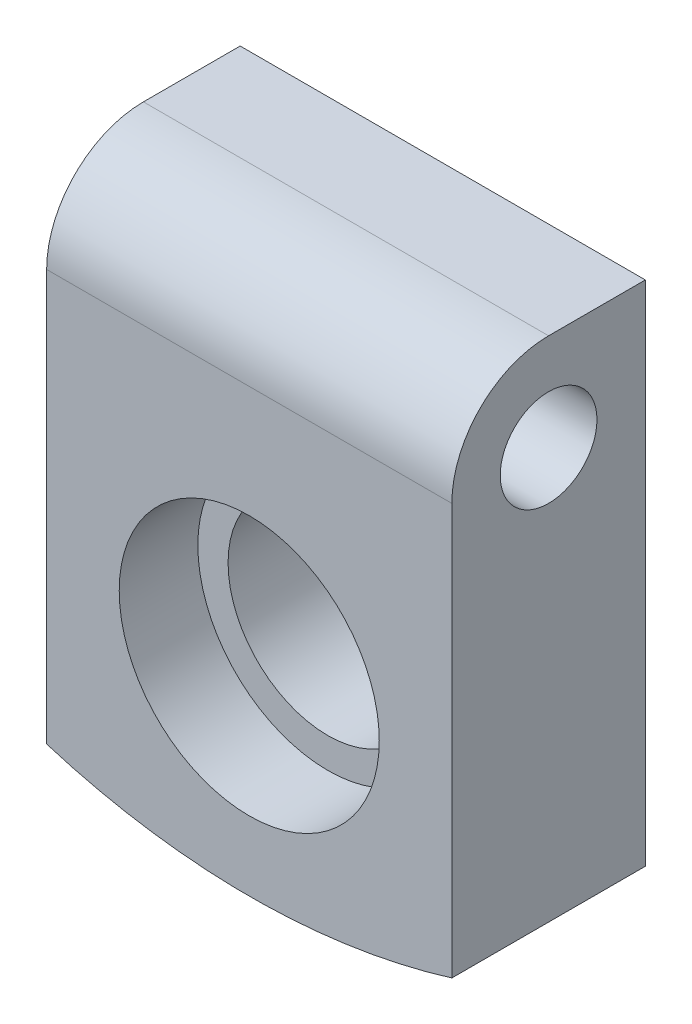
ISO-10303-21;
HEADER;
FILE_DESCRIPTION(('STEP AP214'),'2;1');
FILE_NAME('part.step','',(''),(''),'','','');
FILE_SCHEMA(('AUTOMOTIVE_DESIGN { 1 0 10303 214 1 1 1 1 }'));
ENDSEC;
DATA;
#1=APPLICATION_CONTEXT('core data for automotive mechanical design processes');
#2=APPLICATION_PROTOCOL_DEFINITION('international standard','automotive_design',2000,#1);
#3=PRODUCT_CONTEXT('',#1,'mechanical');
#4=PRODUCT('Part','Part','',(#3));
#5=PRODUCT_RELATED_PRODUCT_CATEGORY('part','',(#4));
#6=PRODUCT_DEFINITION_FORMATION('','',#4);
#7=PRODUCT_DEFINITION_CONTEXT('part definition',#1,'design');
#8=PRODUCT_DEFINITION('design','',#6,#7);
#9=PRODUCT_DEFINITION_SHAPE('','',#8);
#10=(LENGTH_UNIT() NAMED_UNIT(*) SI_UNIT(.MILLI.,.METRE.));
#11=(NAMED_UNIT(*) PLANE_ANGLE_UNIT() SI_UNIT($,.RADIAN.));
#12=(NAMED_UNIT(*) SI_UNIT($,.STERADIAN.) SOLID_ANGLE_UNIT());
#13=UNCERTAINTY_MEASURE_WITH_UNIT(LENGTH_MEASURE(1.E-05),#10,'distance_accuracy_value','');
#14=(GEOMETRIC_REPRESENTATION_CONTEXT(3) GLOBAL_UNCERTAINTY_ASSIGNED_CONTEXT((#13)) GLOBAL_UNIT_ASSIGNED_CONTEXT((#10,
#11,#12)) REPRESENTATION_CONTEXT('',''));
#15=CARTESIAN_POINT('',(0.,0.,0.));
#16=DIRECTION('',(0.,0.,1.));
#17=DIRECTION('',(1.,0.,0.));
#18=AXIS2_PLACEMENT_3D('',#15,#16,#17);
#19=CARTESIAN_POINT('',(-33.5,0.,16.));
#20=DIRECTION('',(1.,0.,0.));
#21=DIRECTION('',(0.,1.,0.));
#22=AXIS2_PLACEMENT_3D('',#19,#20,#21);
#23=PLANE('',#22);
#24=CARTESIAN_POINT('',(-33.5,-16.,0.));
#25=DIRECTION('',(1.,0.,0.));
#26=DIRECTION('',(0.,0.,-1.));
#27=AXIS2_PLACEMENT_3D('',#24,#25,#26);
#28=CIRCLE('',#27,8.);
#29=CARTESIAN_POINT('',(-33.5,-16.,-8.));
#30=VERTEX_POINT('',#29);
#31=EDGE_CURVE('E147',#30,#30,#28,.T.);
#32=ORIENTED_EDGE('',*,*,#31,.T.);
#33=EDGE_LOOP('',(#32));
#34=FACE_BOUND('',#33,.T.);
#35=DIRECTION('',(0.,-1.,0.));
#36=VECTOR('',#35,1.);
#37=CARTESIAN_POINT('',(-33.5,0.,16.));
#38=LINE('',#37,#36);
#39=CARTESIAN_POINT('',(-33.5,-16.,16.));
#40=VERTEX_POINT('',#39);
#41=CARTESIAN_POINT('',(-33.5,-83.9667380442307,16.));
#42=VERTEX_POINT('',#41);
#43=EDGE_CURVE('E69',#40,#42,#38,.T.);
#44=ORIENTED_EDGE('',*,*,#43,.F.);
#45=CARTESIAN_POINT('',(-33.5,-16.,0.));
#46=DIRECTION('',(-1.,0.,0.));
#47=DIRECTION('',(0.,0.,1.));
#48=AXIS2_PLACEMENT_3D('',#45,#46,#47);
#49=CIRCLE('',#48,16.);
#50=CARTESIAN_POINT('',(-33.5,0.,0.));
#51=VERTEX_POINT('',#50);
#52=EDGE_CURVE('E62',#40,#51,#49,.T.);
#53=ORIENTED_EDGE('',*,*,#52,.T.);
#54=DIRECTION('',(0.,0.,-1.));
#55=VECTOR('',#54,1.);
#56=CARTESIAN_POINT('',(-33.5,0.,16.));
#57=LINE('',#56,#55);
#58=CARTESIAN_POINT('',(-33.5,0.,-16.));
#59=VERTEX_POINT('',#58);
#60=EDGE_CURVE('E91',#51,#59,#57,.T.);
#61=ORIENTED_EDGE('',*,*,#60,.T.);
#62=DIRECTION('',(0.,-1.,0.));
#63=VECTOR('',#62,1.);
#64=CARTESIAN_POINT('',(-33.5,0.,-16.));
#65=LINE('',#64,#63);
#66=CARTESIAN_POINT('',(-33.5,-83.9667380442307,-16.));
#67=VERTEX_POINT('',#66);
#68=EDGE_CURVE('E86',#59,#67,#65,.T.);
#69=ORIENTED_EDGE('',*,*,#68,.T.);
#70=DIRECTION('',(0.,0.,-1.));
#71=VECTOR('',#70,1.);
#72=CARTESIAN_POINT('',(-33.5,-83.9667380442307,16.));
#73=LINE('',#72,#71);
#74=EDGE_CURVE('E89',#42,#67,#73,.T.);
#75=ORIENTED_EDGE('',*,*,#74,.F.);
#76=EDGE_LOOP('',(#44,#53,#61,#69,#75));
#77=FACE_BOUND('',#76,.T.);
#78=ADVANCED_FACE('F44',(#34,#77),#23,.F.);
#79=CARTESIAN_POINT('',(0.,25.0000000000001,16.));
#80=DIRECTION('',(0.,0.,-1.));
#81=DIRECTION('',(-1.,0.,0.));
#82=AXIS2_PLACEMENT_3D('',#79,#80,#81);
#83=CYLINDRICAL_SURFACE('',#82,114.);
#84=CARTESIAN_POINT('',(0.,25.0000000000001,-16.));
#85=DIRECTION('',(0.,0.,1.));
#86=DIRECTION('',(1.,0.,0.));
#87=AXIS2_PLACEMENT_3D('',#84,#85,#86);
#88=CIRCLE('',#87,114.);
#89=CARTESIAN_POINT('',(33.5,-83.9667380442307,-16.));
#90=VERTEX_POINT('',#89);
#91=EDGE_CURVE('E104',#67,#90,#88,.T.);
#92=ORIENTED_EDGE('',*,*,#91,.T.);
#93=DIRECTION('',(0.,0.,-1.));
#94=VECTOR('',#93,1.);
#95=CARTESIAN_POINT('',(33.5,-83.9667380442307,16.));
#96=LINE('',#95,#94);
#97=CARTESIAN_POINT('',(33.5,-83.9667380442307,16.));
#98=VERTEX_POINT('',#97);
#99=EDGE_CURVE('E11',#98,#90,#96,.T.);
#100=ORIENTED_EDGE('',*,*,#99,.F.);
#101=CARTESIAN_POINT('',(0.,25.0000000000001,16.));
#102=DIRECTION('',(0.,0.,1.));
#103=DIRECTION('',(1.,0.,0.));
#104=AXIS2_PLACEMENT_3D('',#101,#102,#103);
#105=CIRCLE('',#104,114.);
#106=EDGE_CURVE('E97',#42,#98,#105,.T.);
#107=ORIENTED_EDGE('',*,*,#106,.F.);
#108=ORIENTED_EDGE('',*,*,#74,.T.);
#109=EDGE_LOOP('',(#92,#100,#107,#108));
#110=FACE_BOUND('',#109,.T.);
#111=ADVANCED_FACE('F50',(#110),#83,.T.);
#112=CARTESIAN_POINT('',(33.5,0.,16.));
#113=DIRECTION('',(-1.,0.,0.));
#114=DIRECTION('',(0.,-1.,0.));
#115=AXIS2_PLACEMENT_3D('',#112,#113,#114);
#116=PLANE('',#115);
#117=CARTESIAN_POINT('',(33.5,-16.,0.));
#118=DIRECTION('',(1.,0.,0.));
#119=DIRECTION('',(0.,0.,-1.));
#120=AXIS2_PLACEMENT_3D('',#117,#118,#119);
#121=CIRCLE('',#120,8.);
#122=CARTESIAN_POINT('',(33.5,-16.,-8.));
#123=VERTEX_POINT('',#122);
#124=EDGE_CURVE('E152',#123,#123,#121,.T.);
#125=ORIENTED_EDGE('',*,*,#124,.F.);
#126=EDGE_LOOP('',(#125));
#127=FACE_BOUND('',#126,.T.);
#128=CARTESIAN_POINT('',(33.5,-16.,0.));
#129=DIRECTION('',(-1.,0.,0.));
#130=DIRECTION('',(0.,0.,1.));
#131=AXIS2_PLACEMENT_3D('',#128,#129,#130);
#132=CIRCLE('',#131,16.);
#133=CARTESIAN_POINT('',(33.5,-16.,16.));
#134=VERTEX_POINT('',#133);
#135=CARTESIAN_POINT('',(33.5,0.,0.));
#136=VERTEX_POINT('',#135);
#137=EDGE_CURVE('E138',#134,#136,#132,.T.);
#138=ORIENTED_EDGE('',*,*,#137,.F.);
#139=DIRECTION('',(0.,1.,0.));
#140=VECTOR('',#139,1.);
#141=CARTESIAN_POINT('',(33.5,0.,16.));
#142=LINE('',#141,#140);
#143=EDGE_CURVE('E133',#98,#134,#142,.T.);
#144=ORIENTED_EDGE('',*,*,#143,.F.);
#145=ORIENTED_EDGE('',*,*,#99,.T.);
#146=DIRECTION('',(0.,1.,0.));
#147=VECTOR('',#146,1.);
#148=CARTESIAN_POINT('',(33.5,0.,-16.));
#149=LINE('',#148,#147);
#150=CARTESIAN_POINT('',(33.5,0.,-16.));
#151=VERTEX_POINT('',#150);
#152=EDGE_CURVE('E109',#90,#151,#149,.T.);
#153=ORIENTED_EDGE('',*,*,#152,.T.);
#154=DIRECTION('',(0.,0.,-1.));
#155=VECTOR('',#154,1.);
#156=CARTESIAN_POINT('',(33.5,0.,16.));
#157=LINE('',#156,#155);
#158=EDGE_CURVE('E53',#136,#151,#157,.T.);
#159=ORIENTED_EDGE('',*,*,#158,.F.);
#160=EDGE_LOOP('',(#138,#144,#145,#153,#159));
#161=FACE_BOUND('',#160,.T.);
#162=ADVANCED_FACE('F134',(#127,#161),#116,.F.);
#163=CARTESIAN_POINT('',(-33.5,0.,16.));
#164=DIRECTION('',(0.,-1.,0.));
#165=DIRECTION('',(0.,0.,-1.));
#166=AXIS2_PLACEMENT_3D('',#163,#164,#165);
#167=PLANE('',#166);
#168=ORIENTED_EDGE('',*,*,#60,.F.);
#169=DIRECTION('',(1.,0.,0.));
#170=VECTOR('',#169,1.);
#171=CARTESIAN_POINT('',(-33.5,0.,0.));
#172=LINE('',#171,#170);
#173=EDGE_CURVE('E120',#51,#136,#172,.T.);
#174=ORIENTED_EDGE('',*,*,#173,.T.);
#175=ORIENTED_EDGE('',*,*,#158,.T.);
#176=DIRECTION('',(-1.,0.,0.));
#177=VECTOR('',#176,1.);
#178=CARTESIAN_POINT('',(-33.5,0.,-16.));
#179=LINE('',#178,#177);
#180=EDGE_CURVE('E99',#151,#59,#179,.T.);
#181=ORIENTED_EDGE('',*,*,#180,.T.);
#182=EDGE_LOOP('',(#168,#174,#175,#181));
#183=FACE_BOUND('',#182,.T.);
#184=ADVANCED_FACE('F129',(#183),#167,.F.);
#185=CARTESIAN_POINT('',(0.,25.0000000000001,16.));
#186=DIRECTION('',(0.,0.,1.));
#187=DIRECTION('',(1.,0.,0.));
#188=AXIS2_PLACEMENT_3D('',#185,#186,#187);
#189=PLANE('',#188);
#190=CARTESIAN_POINT('',(0.,-56.,16.));
#191=DIRECTION('',(0.,0.,1.));
#192=DIRECTION('',(1.,0.,0.));
#193=AXIS2_PLACEMENT_3D('',#190,#191,#192);
#194=CIRCLE('',#193,21.5);
#195=CARTESIAN_POINT('',(21.5,-56.,16.));
#196=VERTEX_POINT('',#195);
#197=EDGE_CURVE('E168',#196,#196,#194,.T.);
#198=ORIENTED_EDGE('',*,*,#197,.F.);
#199=EDGE_LOOP('',(#198));
#200=FACE_BOUND('',#199,.T.);
#201=DIRECTION('',(1.,0.,0.));
#202=VECTOR('',#201,1.);
#203=CARTESIAN_POINT('',(-33.5,-16.,16.));
#204=LINE('',#203,#202);
#205=EDGE_CURVE('E115',#40,#134,#204,.T.);
#206=ORIENTED_EDGE('',*,*,#205,.F.);
#207=ORIENTED_EDGE('',*,*,#43,.T.);
#208=ORIENTED_EDGE('',*,*,#106,.T.);
#209=ORIENTED_EDGE('',*,*,#143,.T.);
#210=EDGE_LOOP('',(#206,#207,#208,#209));
#211=FACE_BOUND('',#210,.T.);
#212=ADVANCED_FACE('F136',(#200,#211),#189,.T.);
#213=CARTESIAN_POINT('',(0.,25.0000000000001,-16.));
#214=DIRECTION('',(0.,0.,1.));
#215=DIRECTION('',(1.,0.,0.));
#216=AXIS2_PLACEMENT_3D('',#213,#214,#215);
#217=PLANE('',#216);
#218=CARTESIAN_POINT('',(0.,-56.,-16.));
#219=DIRECTION('',(0.,0.,1.));
#220=DIRECTION('',(1.,0.,0.));
#221=AXIS2_PLACEMENT_3D('',#218,#219,#220);
#222=CIRCLE('',#221,16.5);
#223=CARTESIAN_POINT('',(16.5,-56.,-16.));
#224=VERTEX_POINT('',#223);
#225=EDGE_CURVE('E158',#224,#224,#222,.T.);
#226=ORIENTED_EDGE('',*,*,#225,.T.);
#227=EDGE_LOOP('',(#226));
#228=FACE_BOUND('',#227,.T.);
#229=ORIENTED_EDGE('',*,*,#91,.F.);
#230=ORIENTED_EDGE('',*,*,#68,.F.);
#231=ORIENTED_EDGE('',*,*,#180,.F.);
#232=ORIENTED_EDGE('',*,*,#152,.F.);
#233=EDGE_LOOP('',(#229,#230,#231,#232));
#234=FACE_BOUND('',#233,.T.);
#235=ADVANCED_FACE('F107',(#228,#234),#217,.F.);
#236=CARTESIAN_POINT('',(-33.5,-16.,0.));
#237=DIRECTION('',(1.,0.,0.));
#238=DIRECTION('',(0.,0.,-1.));
#239=AXIS2_PLACEMENT_3D('',#236,#237,#238);
#240=CYLINDRICAL_SURFACE('',#239,16.);
#241=ORIENTED_EDGE('',*,*,#173,.F.);
#242=ORIENTED_EDGE('',*,*,#52,.F.);
#243=ORIENTED_EDGE('',*,*,#205,.T.);
#244=ORIENTED_EDGE('',*,*,#137,.T.);
#245=EDGE_LOOP('',(#241,#242,#243,#244));
#246=FACE_BOUND('',#245,.T.);
#247=ADVANCED_FACE('F184',(#246),#240,.T.);
#248=CARTESIAN_POINT('',(-33.5,-16.,0.));
#249=DIRECTION('',(1.,0.,0.));
#250=DIRECTION('',(0.,0.,-1.));
#251=AXIS2_PLACEMENT_3D('',#248,#249,#250);
#252=CYLINDRICAL_SURFACE('',#251,8.);
#253=ORIENTED_EDGE('',*,*,#31,.F.);
#254=EDGE_LOOP('',(#253));
#255=FACE_BOUND('',#254,.T.);
#256=ORIENTED_EDGE('',*,*,#124,.T.);
#257=EDGE_LOOP('',(#256));
#258=FACE_BOUND('',#257,.T.);
#259=ADVANCED_FACE('F201',(#255,#258),#252,.F.);
#260=CARTESIAN_POINT('',(0.,-56.,16.));
#261=DIRECTION('',(0.,0.,1.));
#262=DIRECTION('',(1.,0.,0.));
#263=AXIS2_PLACEMENT_3D('',#260,#261,#262);
#264=CYLINDRICAL_SURFACE('',#263,16.5);
#265=CARTESIAN_POINT('',(0.,-56.,3.));
#266=DIRECTION('',(0.,0.,1.));
#267=DIRECTION('',(1.,0.,0.));
#268=AXIS2_PLACEMENT_3D('',#265,#266,#267);
#269=CIRCLE('',#268,16.5);
#270=CARTESIAN_POINT('',(16.5,-56.,3.));
#271=VERTEX_POINT('',#270);
#272=EDGE_CURVE('E165',#271,#271,#269,.T.);
#273=ORIENTED_EDGE('',*,*,#272,.T.);
#274=EDGE_LOOP('',(#273));
#275=FACE_BOUND('',#274,.T.);
#276=ORIENTED_EDGE('',*,*,#225,.F.);
#277=EDGE_LOOP('',(#276));
#278=FACE_BOUND('',#277,.T.);
#279=ADVANCED_FACE('F204',(#275,#278),#264,.F.);
#280=CARTESIAN_POINT('',(0.,-34.5,3.));
#281=DIRECTION('',(0.,0.,1.));
#282=DIRECTION('',(1.,0.,0.));
#283=AXIS2_PLACEMENT_3D('',#280,#281,#282);
#284=PLANE('',#283);
#285=CARTESIAN_POINT('',(0.,-56.,3.));
#286=DIRECTION('',(0.,0.,1.));
#287=DIRECTION('',(1.,0.,0.));
#288=AXIS2_PLACEMENT_3D('',#285,#286,#287);
#289=CIRCLE('',#288,21.5);
#290=CARTESIAN_POINT('',(21.5,-56.,3.));
#291=VERTEX_POINT('',#290);
#292=EDGE_CURVE('E167',#291,#291,#289,.T.);
#293=ORIENTED_EDGE('',*,*,#292,.T.);
#294=EDGE_LOOP('',(#293));
#295=FACE_BOUND('',#294,.T.);
#296=ORIENTED_EDGE('',*,*,#272,.F.);
#297=EDGE_LOOP('',(#296));
#298=FACE_BOUND('',#297,.T.);
#299=ADVANCED_FACE('F209',(#295,#298),#284,.T.);
#300=CARTESIAN_POINT('',(0.,-56.,16.));
#301=DIRECTION('',(0.,0.,1.));
#302=DIRECTION('',(1.,0.,0.));
#303=AXIS2_PLACEMENT_3D('',#300,#301,#302);
#304=CYLINDRICAL_SURFACE('',#303,21.5);
#305=ORIENTED_EDGE('',*,*,#197,.T.);
#306=EDGE_LOOP('',(#305));
#307=FACE_BOUND('',#306,.T.);
#308=ORIENTED_EDGE('',*,*,#292,.F.);
#309=EDGE_LOOP('',(#308));
#310=FACE_BOUND('',#309,.T.);
#311=ADVANCED_FACE('F173',(#307,#310),#304,.F.);
#312=CLOSED_SHELL('',(#78,#111,#162,#184,#212,#235,#247,#259,#279,#299,#311));
#313=MANIFOLD_SOLID_BREP('B2',#312);
#314=ADVANCED_BREP_SHAPE_REPRESENTATION('',(#18,#313),#14);
#315=SHAPE_DEFINITION_REPRESENTATION(#9,#314);
ENDSEC;
END-ISO-10303-21;
